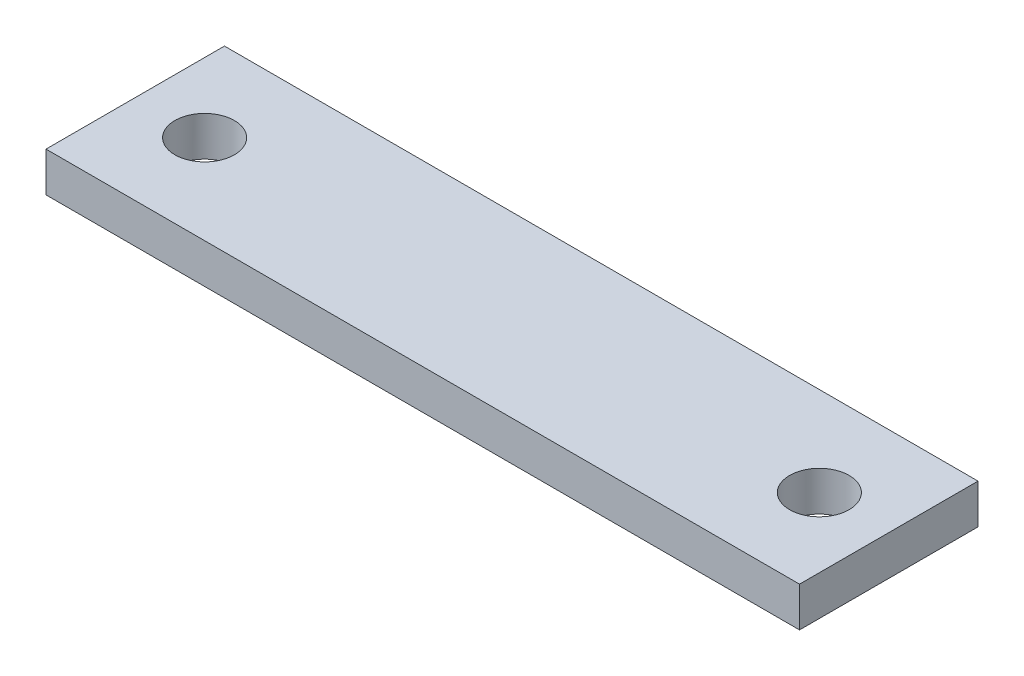
ISO-10303-21;
HEADER;
FILE_DESCRIPTION(('STEP AP214'),'2;1');
FILE_NAME('part.step','',(''),(''),'','','');
FILE_SCHEMA(('AUTOMOTIVE_DESIGN { 1 0 10303 214 1 1 1 1 }'));
ENDSEC;
DATA;
#1=APPLICATION_CONTEXT('core data for automotive mechanical design processes');
#2=APPLICATION_PROTOCOL_DEFINITION('international standard','automotive_design',2000,#1);
#3=PRODUCT_CONTEXT('',#1,'mechanical');
#4=PRODUCT('Part','Part','',(#3));
#5=PRODUCT_RELATED_PRODUCT_CATEGORY('part','',(#4));
#6=PRODUCT_DEFINITION_FORMATION('','',#4);
#7=PRODUCT_DEFINITION_CONTEXT('part definition',#1,'design');
#8=PRODUCT_DEFINITION('design','',#6,#7);
#9=PRODUCT_DEFINITION_SHAPE('','',#8);
#10=(LENGTH_UNIT() NAMED_UNIT(*) SI_UNIT(.MILLI.,.METRE.));
#11=(NAMED_UNIT(*) PLANE_ANGLE_UNIT() SI_UNIT($,.RADIAN.));
#12=(NAMED_UNIT(*) SI_UNIT($,.STERADIAN.) SOLID_ANGLE_UNIT());
#13=UNCERTAINTY_MEASURE_WITH_UNIT(LENGTH_MEASURE(1.E-05),#10,'distance_accuracy_value','');
#14=(GEOMETRIC_REPRESENTATION_CONTEXT(3) GLOBAL_UNCERTAINTY_ASSIGNED_CONTEXT((#13)) GLOBAL_UNIT_ASSIGNED_CONTEXT((#10,
#11,#12)) REPRESENTATION_CONTEXT('',''));
#15=CARTESIAN_POINT('',(0.,0.,0.));
#16=DIRECTION('',(0.,0.,1.));
#17=DIRECTION('',(1.,0.,0.));
#18=AXIS2_PLACEMENT_3D('',#15,#16,#17);
#19=CARTESIAN_POINT('',(19.,2.,4.5));
#20=DIRECTION('',(-1.,0.,0.));
#21=DIRECTION('',(0.,0.,1.));
#22=AXIS2_PLACEMENT_3D('',#19,#20,#21);
#23=PLANE('',#22);
#24=DIRECTION('',(0.,0.,-1.));
#25=VECTOR('',#24,1.);
#26=CARTESIAN_POINT('',(19.,0.,4.5));
#27=LINE('',#26,#25);
#28=CARTESIAN_POINT('',(19.,0.,4.5));
#29=VERTEX_POINT('',#28);
#30=CARTESIAN_POINT('',(19.,0.,-4.5));
#31=VERTEX_POINT('',#30);
#32=EDGE_CURVE('E101',#29,#31,#27,.T.);
#33=ORIENTED_EDGE('',*,*,#32,.T.);
#34=DIRECTION('',(0.,-1.,0.));
#35=VECTOR('',#34,1.);
#36=CARTESIAN_POINT('',(19.,2.,-4.5));
#37=LINE('',#36,#35);
#38=CARTESIAN_POINT('',(19.,2.,-4.5));
#39=VERTEX_POINT('',#38);
#40=EDGE_CURVE('E11',#39,#31,#37,.T.);
#41=ORIENTED_EDGE('',*,*,#40,.F.);
#42=DIRECTION('',(0.,0.,-1.));
#43=VECTOR('',#42,1.);
#44=CARTESIAN_POINT('',(19.,2.,4.5));
#45=LINE('',#44,#43);
#46=CARTESIAN_POINT('',(19.,2.,4.5));
#47=VERTEX_POINT('',#46);
#48=EDGE_CURVE('E89',#47,#39,#45,.T.);
#49=ORIENTED_EDGE('',*,*,#48,.F.);
#50=DIRECTION('',(0.,-1.,0.));
#51=VECTOR('',#50,1.);
#52=CARTESIAN_POINT('',(19.,2.,4.5));
#53=LINE('',#52,#51);
#54=EDGE_CURVE('E97',#47,#29,#53,.T.);
#55=ORIENTED_EDGE('',*,*,#54,.T.);
#56=EDGE_LOOP('',(#33,#41,#49,#55));
#57=FACE_BOUND('',#56,.T.);
#58=ADVANCED_FACE('F38',(#57),#23,.F.);
#59=CARTESIAN_POINT('',(-19.,2.,-4.5));
#60=DIRECTION('',(0.,0.,1.));
#61=DIRECTION('',(1.,0.,0.));
#62=AXIS2_PLACEMENT_3D('',#59,#60,#61);
#63=PLANE('',#62);
#64=DIRECTION('',(-1.,0.,0.));
#65=VECTOR('',#64,1.);
#66=CARTESIAN_POINT('',(-19.,0.,-4.5));
#67=LINE('',#66,#65);
#68=CARTESIAN_POINT('',(-19.,0.,-4.5));
#69=VERTEX_POINT('',#68);
#70=EDGE_CURVE('E93',#31,#69,#67,.T.);
#71=ORIENTED_EDGE('',*,*,#70,.T.);
#72=DIRECTION('',(0.,-1.,0.));
#73=VECTOR('',#72,1.);
#74=CARTESIAN_POINT('',(-19.,2.,-4.5));
#75=LINE('',#74,#73);
#76=CARTESIAN_POINT('',(-19.,2.,-4.5));
#77=VERTEX_POINT('',#76);
#78=EDGE_CURVE('E46',#77,#69,#75,.T.);
#79=ORIENTED_EDGE('',*,*,#78,.F.);
#80=DIRECTION('',(-1.,0.,0.));
#81=VECTOR('',#80,1.);
#82=CARTESIAN_POINT('',(-19.,2.,-4.5));
#83=LINE('',#82,#81);
#84=EDGE_CURVE('E84',#39,#77,#83,.T.);
#85=ORIENTED_EDGE('',*,*,#84,.F.);
#86=ORIENTED_EDGE('',*,*,#40,.T.);
#87=EDGE_LOOP('',(#71,#79,#85,#86));
#88=FACE_BOUND('',#87,.T.);
#89=ADVANCED_FACE('F92',(#88),#63,.F.);
#90=CARTESIAN_POINT('',(-19.,2.,4.5));
#91=DIRECTION('',(1.,0.,0.));
#92=DIRECTION('',(0.,0.,-1.));
#93=AXIS2_PLACEMENT_3D('',#90,#91,#92);
#94=PLANE('',#93);
#95=DIRECTION('',(0.,0.,1.));
#96=VECTOR('',#95,1.);
#97=CARTESIAN_POINT('',(-19.,0.,4.5));
#98=LINE('',#97,#96);
#99=CARTESIAN_POINT('',(-19.,0.,4.5));
#100=VERTEX_POINT('',#99);
#101=EDGE_CURVE('E71',#69,#100,#98,.T.);
#102=ORIENTED_EDGE('',*,*,#101,.T.);
#103=DIRECTION('',(0.,-1.,0.));
#104=VECTOR('',#103,1.);
#105=CARTESIAN_POINT('',(-19.,2.,4.5));
#106=LINE('',#105,#104);
#107=CARTESIAN_POINT('',(-19.,2.,4.5));
#108=VERTEX_POINT('',#107);
#109=EDGE_CURVE('E94',#108,#100,#106,.T.);
#110=ORIENTED_EDGE('',*,*,#109,.F.);
#111=DIRECTION('',(0.,0.,1.));
#112=VECTOR('',#111,1.);
#113=CARTESIAN_POINT('',(-19.,2.,4.5));
#114=LINE('',#113,#112);
#115=EDGE_CURVE('E87',#77,#108,#114,.T.);
#116=ORIENTED_EDGE('',*,*,#115,.F.);
#117=ORIENTED_EDGE('',*,*,#78,.T.);
#118=EDGE_LOOP('',(#102,#110,#116,#117));
#119=FACE_BOUND('',#118,.T.);
#120=ADVANCED_FACE('F95',(#119),#94,.F.);
#121=CARTESIAN_POINT('',(-19.,2.,4.5));
#122=DIRECTION('',(0.,0.,-1.));
#123=DIRECTION('',(-1.,0.,0.));
#124=AXIS2_PLACEMENT_3D('',#121,#122,#123);
#125=PLANE('',#124);
#126=DIRECTION('',(1.,0.,0.));
#127=VECTOR('',#126,1.);
#128=CARTESIAN_POINT('',(-19.,0.,4.5));
#129=LINE('',#128,#127);
#130=EDGE_CURVE('E77',#100,#29,#129,.T.);
#131=ORIENTED_EDGE('',*,*,#130,.T.);
#132=ORIENTED_EDGE('',*,*,#54,.F.);
#133=DIRECTION('',(1.,0.,0.));
#134=VECTOR('',#133,1.);
#135=CARTESIAN_POINT('',(-19.,2.,4.5));
#136=LINE('',#135,#134);
#137=EDGE_CURVE('E54',#108,#47,#136,.T.);
#138=ORIENTED_EDGE('',*,*,#137,.F.);
#139=ORIENTED_EDGE('',*,*,#109,.T.);
#140=EDGE_LOOP('',(#131,#132,#138,#139));
#141=FACE_BOUND('',#140,.T.);
#142=ADVANCED_FACE('F109',(#141),#125,.F.);
#143=CARTESIAN_POINT('',(0.,2.,0.));
#144=DIRECTION('',(0.,-1.,0.));
#145=DIRECTION('',(0.,0.,-1.));
#146=AXIS2_PLACEMENT_3D('',#143,#144,#145);
#147=PLANE('',#146);
#148=CARTESIAN_POINT('',(-15.5,2.,0.));
#149=DIRECTION('',(0.,1.,0.));
#150=DIRECTION('',(0.,0.,1.));
#151=AXIS2_PLACEMENT_3D('',#148,#149,#150);
#152=CIRCLE('',#151,1.5);
#153=CARTESIAN_POINT('',(-15.5,2.,1.5));
#154=VERTEX_POINT('',#153);
#155=EDGE_CURVE('E104',#154,#154,#152,.T.);
#156=ORIENTED_EDGE('',*,*,#155,.F.);
#157=EDGE_LOOP('',(#156));
#158=FACE_BOUND('',#157,.T.);
#159=CARTESIAN_POINT('',(15.5,2.,0.));
#160=DIRECTION('',(0.,1.,0.));
#161=DIRECTION('',(0.,0.,-1.));
#162=AXIS2_PLACEMENT_3D('',#159,#160,#161);
#163=CIRCLE('',#162,1.5);
#164=CARTESIAN_POINT('',(15.5,2.,-1.5));
#165=VERTEX_POINT('',#164);
#166=EDGE_CURVE('E118',#165,#165,#163,.T.);
#167=ORIENTED_EDGE('',*,*,#166,.F.);
#168=EDGE_LOOP('',(#167));
#169=FACE_BOUND('',#168,.T.);
#170=ORIENTED_EDGE('',*,*,#48,.T.);
#171=ORIENTED_EDGE('',*,*,#84,.T.);
#172=ORIENTED_EDGE('',*,*,#115,.T.);
#173=ORIENTED_EDGE('',*,*,#137,.T.);
#174=EDGE_LOOP('',(#170,#171,#172,#173));
#175=FACE_BOUND('',#174,.T.);
#176=ADVANCED_FACE('F85',(#158,#169,#175),#147,.F.);
#177=CARTESIAN_POINT('',(0.,0.,0.));
#178=DIRECTION('',(0.,-1.,0.));
#179=DIRECTION('',(0.,0.,-1.));
#180=AXIS2_PLACEMENT_3D('',#177,#178,#179);
#181=PLANE('',#180);
#182=CARTESIAN_POINT('',(-15.5,0.,0.));
#183=DIRECTION('',(0.,-1.,0.));
#184=DIRECTION('',(0.,0.,-1.));
#185=AXIS2_PLACEMENT_3D('',#182,#183,#184);
#186=CIRCLE('',#185,1.5);
#187=CARTESIAN_POINT('',(-15.5,0.,-1.5));
#188=VERTEX_POINT('',#187);
#189=EDGE_CURVE('E121',#188,#188,#186,.F.);
#190=ORIENTED_EDGE('',*,*,#189,.T.);
#191=EDGE_LOOP('',(#190));
#192=FACE_BOUND('',#191,.T.);
#193=CARTESIAN_POINT('',(15.5,0.,0.));
#194=DIRECTION('',(0.,-1.,0.));
#195=DIRECTION('',(0.,0.,-1.));
#196=AXIS2_PLACEMENT_3D('',#193,#194,#195);
#197=CIRCLE('',#196,1.5);
#198=CARTESIAN_POINT('',(15.5,0.,-1.5));
#199=VERTEX_POINT('',#198);
#200=EDGE_CURVE('E115',#199,#199,#197,.F.);
#201=ORIENTED_EDGE('',*,*,#200,.T.);
#202=EDGE_LOOP('',(#201));
#203=FACE_BOUND('',#202,.T.);
#204=ORIENTED_EDGE('',*,*,#32,.F.);
#205=ORIENTED_EDGE('',*,*,#130,.F.);
#206=ORIENTED_EDGE('',*,*,#101,.F.);
#207=ORIENTED_EDGE('',*,*,#70,.F.);
#208=EDGE_LOOP('',(#204,#205,#206,#207));
#209=FACE_BOUND('',#208,.T.);
#210=ADVANCED_FACE('F112',(#192,#203,#209),#181,.T.);
#211=CARTESIAN_POINT('',(15.5,-0.00100000000000013,0.));
#212=DIRECTION('',(0.,1.,0.));
#213=DIRECTION('',(0.,0.,1.));
#214=AXIS2_PLACEMENT_3D('',#211,#212,#213);
#215=CYLINDRICAL_SURFACE('',#214,1.5);
#216=ORIENTED_EDGE('',*,*,#200,.F.);
#217=EDGE_LOOP('',(#216));
#218=FACE_BOUND('',#217,.T.);
#219=ORIENTED_EDGE('',*,*,#166,.T.);
#220=EDGE_LOOP('',(#219));
#221=FACE_BOUND('',#220,.T.);
#222=ADVANCED_FACE('F134',(#218,#221),#215,.F.);
#223=CARTESIAN_POINT('',(-15.5,-0.00100000000000013,0.));
#224=DIRECTION('',(0.,1.,0.));
#225=DIRECTION('',(0.,0.,1.));
#226=AXIS2_PLACEMENT_3D('',#223,#224,#225);
#227=CYLINDRICAL_SURFACE('',#226,1.5);
#228=ORIENTED_EDGE('',*,*,#189,.F.);
#229=EDGE_LOOP('',(#228));
#230=FACE_BOUND('',#229,.T.);
#231=ORIENTED_EDGE('',*,*,#155,.T.);
#232=EDGE_LOOP('',(#231));
#233=FACE_BOUND('',#232,.T.);
#234=ADVANCED_FACE('F127',(#230,#233),#227,.F.);
#235=CLOSED_SHELL('',(#58,#89,#120,#142,#176,#210,#222,#234));
#236=MANIFOLD_SOLID_BREP('B2',#235);
#237=ADVANCED_BREP_SHAPE_REPRESENTATION('',(#18,#236),#14);
#238=SHAPE_DEFINITION_REPRESENTATION(#9,#237);
ENDSEC;
END-ISO-10303-21;
